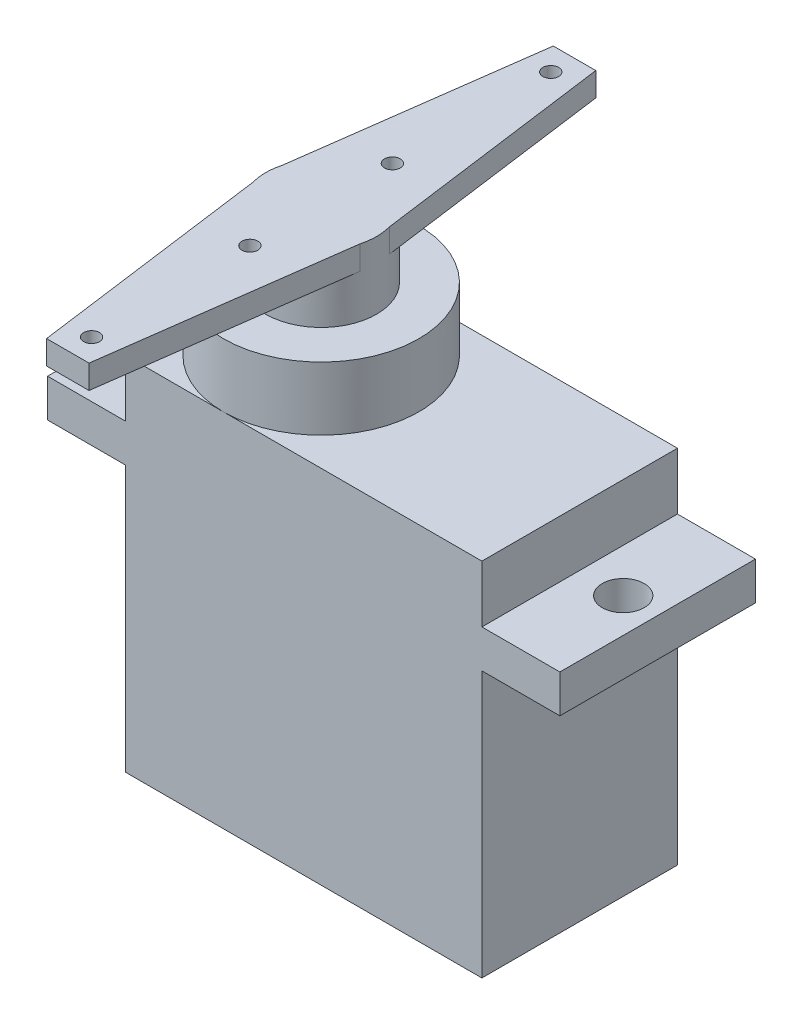
ISO-10303-21;
HEADER;
FILE_DESCRIPTION(('STEP AP214'),'2;1');
FILE_NAME('part.step','',(''),(''),'','','');
FILE_SCHEMA(('AUTOMOTIVE_DESIGN { 1 0 10303 214 1 1 1 1 }'));
ENDSEC;
DATA;
#1=APPLICATION_CONTEXT('core data for automotive mechanical design processes');
#2=APPLICATION_PROTOCOL_DEFINITION('international standard','automotive_design',2000,#1);
#3=PRODUCT_CONTEXT('',#1,'mechanical');
#4=PRODUCT('Part','Part','',(#3));
#5=PRODUCT_RELATED_PRODUCT_CATEGORY('part','',(#4));
#6=PRODUCT_DEFINITION_FORMATION('','',#4);
#7=PRODUCT_DEFINITION_CONTEXT('part definition',#1,'design');
#8=PRODUCT_DEFINITION('design','',#6,#7);
#9=PRODUCT_DEFINITION_SHAPE('','',#8);
#10=(LENGTH_UNIT() NAMED_UNIT(*) SI_UNIT(.MILLI.,.METRE.));
#11=(NAMED_UNIT(*) PLANE_ANGLE_UNIT() SI_UNIT($,.RADIAN.));
#12=(NAMED_UNIT(*) SI_UNIT($,.STERADIAN.) SOLID_ANGLE_UNIT());
#13=UNCERTAINTY_MEASURE_WITH_UNIT(LENGTH_MEASURE(1.E-05),#10,'distance_accuracy_value','');
#14=(GEOMETRIC_REPRESENTATION_CONTEXT(3) GLOBAL_UNCERTAINTY_ASSIGNED_CONTEXT((#13)) GLOBAL_UNIT_ASSIGNED_CONTEXT((#10,
#11,#12)) REPRESENTATION_CONTEXT('',''));
#15=CARTESIAN_POINT('',(0.,0.,0.));
#16=DIRECTION('',(0.,0.,1.));
#17=DIRECTION('',(1.,0.,0.));
#18=AXIS2_PLACEMENT_3D('',#15,#16,#17);
#19=CARTESIAN_POINT('',(-5.07499999999999,31.05,0.));
#20=DIRECTION('',(0.,-1.,0.));
#21=DIRECTION('',(0.,0.,-1.));
#22=AXIS2_PLACEMENT_3D('',#19,#20,#21);
#23=CYLINDRICAL_SURFACE('',#22,3.5);
#24=DIRECTION('',(0.,-1.,0.));
#25=VECTOR('',#24,1.);
#26=CARTESIAN_POINT('',(-8.4498833775891,31.05,0.92744929115976));
#27=LINE('',#26,#25);
#28=CARTESIAN_POINT('',(-8.4498833775891,29.55,0.927449291159753));
#29=VERTEX_POINT('',#28);
#30=CARTESIAN_POINT('',(-8.4498833775891,31.05,0.927449291159757));
#31=VERTEX_POINT('',#30);
#32=EDGE_CURVE('E122',#29,#31,#27,.F.);
#33=ORIENTED_EDGE('',*,*,#32,.T.);
#34=CARTESIAN_POINT('',(-5.07499999999999,31.05,0.));
#35=DIRECTION('',(0.,1.,0.));
#36=DIRECTION('',(0.,0.,1.));
#37=AXIS2_PLACEMENT_3D('',#34,#35,#36);
#38=CIRCLE('',#37,3.5);
#39=CARTESIAN_POINT('',(-8.44988337758911,31.05,-0.927449291159721));
#40=VERTEX_POINT('',#39);
#41=EDGE_CURVE('E178',#40,#31,#38,.T.);
#42=ORIENTED_EDGE('',*,*,#41,.F.);
#43=DIRECTION('',(0.,-1.,0.));
#44=VECTOR('',#43,1.);
#45=CARTESIAN_POINT('',(-8.44988337758911,31.05,-0.927449291159721));
#46=LINE('',#45,#44);
#47=CARTESIAN_POINT('',(-8.44988337758911,29.55,-0.92744929115973));
#48=VERTEX_POINT('',#47);
#49=EDGE_CURVE('E172',#40,#48,#46,.T.);
#50=ORIENTED_EDGE('',*,*,#49,.T.);
#51=CARTESIAN_POINT('',(-5.07499999999999,29.55,0.));
#52=DIRECTION('',(0.,1.,0.));
#53=DIRECTION('',(0.,0.,1.));
#54=AXIS2_PLACEMENT_3D('',#51,#52,#53);
#55=CIRCLE('',#54,3.5);
#56=CARTESIAN_POINT('',(-1.7001166224109,29.55,-0.927449291159806));
#57=VERTEX_POINT('',#56);
#58=EDGE_CURVE('E12',#57,#48,#55,.T.);
#59=ORIENTED_EDGE('',*,*,#58,.F.);
#60=DIRECTION('',(0.,-1.,0.));
#61=VECTOR('',#60,1.);
#62=CARTESIAN_POINT('',(-1.7001166224109,31.05,-0.927449291159806));
#63=LINE('',#62,#61);
#64=CARTESIAN_POINT('',(-1.7001166224109,31.05,-0.927449291159806));
#65=VERTEX_POINT('',#64);
#66=EDGE_CURVE('E169',#57,#65,#63,.F.);
#67=ORIENTED_EDGE('',*,*,#66,.T.);
#68=CARTESIAN_POINT('',(-1.70011662241089,31.05,0.927449291159777));
#69=VERTEX_POINT('',#68);
#70=EDGE_CURVE('E177',#69,#65,#38,.T.);
#71=ORIENTED_EDGE('',*,*,#70,.F.);
#72=DIRECTION('',(0.,-1.,0.));
#73=VECTOR('',#72,1.);
#74=CARTESIAN_POINT('',(-1.70011662241089,31.05,0.927449291159787));
#75=LINE('',#74,#73);
#76=CARTESIAN_POINT('',(-1.70011662241089,29.55,0.927449291159777));
#77=VERTEX_POINT('',#76);
#78=EDGE_CURVE('E162',#69,#77,#75,.T.);
#79=ORIENTED_EDGE('',*,*,#78,.T.);
#80=EDGE_CURVE('E54',#29,#77,#55,.T.);
#81=ORIENTED_EDGE('',*,*,#80,.F.);
#82=EDGE_LOOP('',(#33,#42,#50,#59,#67,#71,#79,#81));
#83=FACE_BOUND('',#82,.T.);
#84=CARTESIAN_POINT('',(-5.07499999999999,26.8,0.));
#85=DIRECTION('',(0.,1.,0.));
#86=DIRECTION('',(0.,0.,1.));
#87=AXIS2_PLACEMENT_3D('',#84,#85,#86);
#88=CIRCLE('',#87,3.5);
#89=CARTESIAN_POINT('',(-5.07499999999999,26.8,3.5));
#90=VERTEX_POINT('',#89);
#91=EDGE_CURVE('E176',#90,#90,#88,.T.);
#92=ORIENTED_EDGE('',*,*,#91,.T.);
#93=EDGE_LOOP('',(#92));
#94=FACE_BOUND('',#93,.T.);
#95=ADVANCED_FACE('F51',(#83,#94),#23,.T.);
#96=CARTESIAN_POINT('',(-5.07499999999999,31.05,0.));
#97=DIRECTION('',(0.,1.,0.));
#98=DIRECTION('',(0.,0.,1.));
#99=AXIS2_PLACEMENT_3D('',#96,#97,#98);
#100=PLANE('',#99);
#101=ORIENTED_EDGE('',*,*,#70,.T.);
#102=DIRECTION('',(-0.133692943723886,0.,-0.99102280336955));
#103=VECTOR('',#102,1.);
#104=CARTESIAN_POINT('',(-1.57499999999999,31.05,0.));
#105=LINE('',#104,#103);
#106=CARTESIAN_POINT('',(-3.73346405583113,31.05,-16.));
#107=VERTEX_POINT('',#106);
#108=EDGE_CURVE('E155',#65,#107,#105,.T.);
#109=ORIENTED_EDGE('',*,*,#108,.T.);
#110=DIRECTION('',(-1.,0.,0.));
#111=VECTOR('',#110,1.);
#112=CARTESIAN_POINT('',(-6.4165359441691,31.05,-16.));
#113=LINE('',#112,#111);
#114=CARTESIAN_POINT('',(-6.4165359441691,31.05,-16.));
#115=VERTEX_POINT('',#114);
#116=EDGE_CURVE('E157',#107,#115,#113,.T.);
#117=ORIENTED_EDGE('',*,*,#116,.T.);
#118=DIRECTION('',(-0.133692943723871,0.,0.991022803369552));
#119=VECTOR('',#118,1.);
#120=CARTESIAN_POINT('',(-8.57499999999999,31.05,0.));
#121=LINE('',#120,#119);
#122=EDGE_CURVE('E65',#115,#40,#121,.T.);
#123=ORIENTED_EDGE('',*,*,#122,.T.);
#124=ORIENTED_EDGE('',*,*,#41,.T.);
#125=DIRECTION('',(0.133692943723879,0.,0.991022803369551));
#126=VECTOR('',#125,1.);
#127=CARTESIAN_POINT('',(-8.57499999999999,31.05,0.));
#128=LINE('',#127,#126);
#129=CARTESIAN_POINT('',(-6.41653594416898,31.05,16.));
#130=VERTEX_POINT('',#129);
#131=EDGE_CURVE('E150',#31,#130,#128,.T.);
#132=ORIENTED_EDGE('',*,*,#131,.T.);
#133=DIRECTION('',(1.,0.,0.));
#134=VECTOR('',#133,1.);
#135=CARTESIAN_POINT('',(-6.41653594416898,31.05,16.));
#136=LINE('',#135,#134);
#137=CARTESIAN_POINT('',(-3.73346405583101,31.05,16.));
#138=VERTEX_POINT('',#137);
#139=EDGE_CURVE('E131',#130,#138,#136,.T.);
#140=ORIENTED_EDGE('',*,*,#139,.T.);
#141=DIRECTION('',(0.133692943723879,0.,-0.991022803369551));
#142=VECTOR('',#141,1.);
#143=CARTESIAN_POINT('',(-1.57499999999999,31.05,0.));
#144=LINE('',#143,#142);
#145=EDGE_CURVE('E72',#138,#69,#144,.T.);
#146=ORIENTED_EDGE('',*,*,#145,.T.);
#147=EDGE_LOOP('',(#101,#109,#117,#123,#124,#132,#140,#146));
#148=FACE_BOUND('',#147,.T.);
#149=CARTESIAN_POINT('',(-5.07499999999993,31.05,14.5));
#150=DIRECTION('',(0.,1.,0.));
#151=DIRECTION('',(0.,0.,-1.));
#152=AXIS2_PLACEMENT_3D('',#149,#150,#151);
#153=CIRCLE('',#152,0.5);
#154=CARTESIAN_POINT('',(-5.07499999999993,31.05,14.));
#155=VERTEX_POINT('',#154);
#156=EDGE_CURVE('E265',#155,#155,#153,.T.);
#157=ORIENTED_EDGE('',*,*,#156,.F.);
#158=EDGE_LOOP('',(#157));
#159=FACE_BOUND('',#158,.T.);
#160=CARTESIAN_POINT('',(-5.07499999999998,31.05,4.5));
#161=DIRECTION('',(0.,1.,0.));
#162=DIRECTION('',(0.,0.,-1.));
#163=AXIS2_PLACEMENT_3D('',#160,#161,#162);
#164=CIRCLE('',#163,0.5);
#165=CARTESIAN_POINT('',(-5.07499999999998,31.05,4.));
#166=VERTEX_POINT('',#165);
#167=EDGE_CURVE('E267',#166,#166,#164,.T.);
#168=ORIENTED_EDGE('',*,*,#167,.F.);
#169=EDGE_LOOP('',(#168));
#170=FACE_BOUND('',#169,.T.);
#171=CARTESIAN_POINT('',(-5.07500000000001,31.05,-4.5));
#172=DIRECTION('',(0.,1.,0.));
#173=DIRECTION('',(0.,0.,1.));
#174=AXIS2_PLACEMENT_3D('',#171,#172,#173);
#175=CIRCLE('',#174,0.500000000000001);
#176=CARTESIAN_POINT('',(-5.07500000000001,31.05,-4.));
#177=VERTEX_POINT('',#176);
#178=EDGE_CURVE('E279',#177,#177,#175,.T.);
#179=ORIENTED_EDGE('',*,*,#178,.F.);
#180=EDGE_LOOP('',(#179));
#181=FACE_BOUND('',#180,.T.);
#182=CARTESIAN_POINT('',(-5.07500000000005,31.05,-14.5));
#183=DIRECTION('',(0.,1.,0.));
#184=DIRECTION('',(0.,0.,1.));
#185=AXIS2_PLACEMENT_3D('',#182,#183,#184);
#186=CIRCLE('',#185,0.5);
#187=CARTESIAN_POINT('',(-5.07500000000005,31.05,-14.));
#188=VERTEX_POINT('',#187);
#189=EDGE_CURVE('E273',#188,#188,#186,.T.);
#190=ORIENTED_EDGE('',*,*,#189,.F.);
#191=EDGE_LOOP('',(#190));
#192=FACE_BOUND('',#191,.T.);
#193=ADVANCED_FACE('F183',(#148,#159,#170,#181,#192),#100,.T.);
#194=CARTESIAN_POINT('',(-5.07499999999999,26.8,0.));
#195=DIRECTION('',(0.,1.,0.));
#196=DIRECTION('',(0.,0.,1.));
#197=AXIS2_PLACEMENT_3D('',#194,#195,#196);
#198=PLANE('',#197);
#199=ORIENTED_EDGE('',*,*,#91,.F.);
#200=EDGE_LOOP('',(#199));
#201=FACE_BOUND('',#200,.T.);
#202=ADVANCED_FACE('F222',(#201),#198,.F.);
#203=CARTESIAN_POINT('',(-5.07499999999998,29.55,4.5));
#204=DIRECTION('',(0.,1.,0.));
#205=DIRECTION('',(0.,0.,1.));
#206=AXIS2_PLACEMENT_3D('',#203,#204,#205);
#207=CYLINDRICAL_SURFACE('',#206,0.5);
#208=CARTESIAN_POINT('',(-5.07499999999998,29.55,4.5));
#209=DIRECTION('',(0.,1.,0.));
#210=DIRECTION('',(0.,0.,-1.));
#211=AXIS2_PLACEMENT_3D('',#208,#209,#210);
#212=CIRCLE('',#211,0.5);
#213=CARTESIAN_POINT('',(-5.07499999999998,29.55,4.));
#214=VERTEX_POINT('',#213);
#215=EDGE_CURVE('E270',#214,#214,#212,.T.);
#216=ORIENTED_EDGE('',*,*,#215,.F.);
#217=EDGE_LOOP('',(#216));
#218=FACE_BOUND('',#217,.T.);
#219=ORIENTED_EDGE('',*,*,#167,.T.);
#220=EDGE_LOOP('',(#219));
#221=FACE_BOUND('',#220,.T.);
#222=ADVANCED_FACE('F227',(#218,#221),#207,.F.);
#223=CARTESIAN_POINT('',(-5.07499999999993,29.55,14.5));
#224=DIRECTION('',(0.,1.,0.));
#225=DIRECTION('',(0.,0.,1.));
#226=AXIS2_PLACEMENT_3D('',#223,#224,#225);
#227=CYLINDRICAL_SURFACE('',#226,0.5);
#228=CARTESIAN_POINT('',(-5.07499999999993,29.55,14.5));
#229=DIRECTION('',(0.,1.,0.));
#230=DIRECTION('',(0.,0.,-1.));
#231=AXIS2_PLACEMENT_3D('',#228,#229,#230);
#232=CIRCLE('',#231,0.5);
#233=CARTESIAN_POINT('',(-5.07499999999993,29.55,14.));
#234=VERTEX_POINT('',#233);
#235=EDGE_CURVE('E262',#234,#234,#232,.T.);
#236=ORIENTED_EDGE('',*,*,#235,.F.);
#237=EDGE_LOOP('',(#236));
#238=FACE_BOUND('',#237,.T.);
#239=ORIENTED_EDGE('',*,*,#156,.T.);
#240=EDGE_LOOP('',(#239));
#241=FACE_BOUND('',#240,.T.);
#242=ADVANCED_FACE('F232',(#238,#241),#227,.F.);
#243=CARTESIAN_POINT('',(-6.41653594416898,29.55,16.));
#244=DIRECTION('',(0.,0.,1.));
#245=DIRECTION('',(1.,0.,0.));
#246=AXIS2_PLACEMENT_3D('',#243,#244,#245);
#247=PLANE('',#246);
#248=ORIENTED_EDGE('',*,*,#139,.F.);
#249=DIRECTION('',(0.,1.,0.));
#250=VECTOR('',#249,1.);
#251=CARTESIAN_POINT('',(-6.41653594416898,29.55,16.));
#252=LINE('',#251,#250);
#253=CARTESIAN_POINT('',(-6.41653594416898,29.55,16.));
#254=VERTEX_POINT('',#253);
#255=EDGE_CURVE('E119',#254,#130,#252,.T.);
#256=ORIENTED_EDGE('',*,*,#255,.F.);
#257=DIRECTION('',(1.,0.,0.));
#258=VECTOR('',#257,1.);
#259=CARTESIAN_POINT('',(-6.41653594416898,29.55,16.));
#260=LINE('',#259,#258);
#261=CARTESIAN_POINT('',(-3.73346405583101,29.55,16.));
#262=VERTEX_POINT('',#261);
#263=EDGE_CURVE('E126',#254,#262,#260,.T.);
#264=ORIENTED_EDGE('',*,*,#263,.T.);
#265=DIRECTION('',(0.,1.,0.));
#266=VECTOR('',#265,1.);
#267=CARTESIAN_POINT('',(-3.73346405583101,29.55,16.));
#268=LINE('',#267,#266);
#269=EDGE_CURVE('E132',#262,#138,#268,.T.);
#270=ORIENTED_EDGE('',*,*,#269,.T.);
#271=EDGE_LOOP('',(#248,#256,#264,#270));
#272=FACE_BOUND('',#271,.T.);
#273=ADVANCED_FACE('F130',(#272),#247,.T.);
#274=CARTESIAN_POINT('',(0.,29.55,0.));
#275=DIRECTION('',(0.,1.,0.));
#276=DIRECTION('',(0.,0.,1.));
#277=AXIS2_PLACEMENT_3D('',#274,#275,#276);
#278=PLANE('',#277);
#279=ORIENTED_EDGE('',*,*,#235,.T.);
#280=EDGE_LOOP('',(#279));
#281=FACE_BOUND('',#280,.T.);
#282=ORIENTED_EDGE('',*,*,#215,.T.);
#283=EDGE_LOOP('',(#282));
#284=FACE_BOUND('',#283,.T.);
#285=DIRECTION('',(0.133692943723879,0.,0.991022803369551));
#286=VECTOR('',#285,1.);
#287=CARTESIAN_POINT('',(-8.57499999999999,29.55,0.));
#288=LINE('',#287,#286);
#289=EDGE_CURVE('E115',#29,#254,#288,.T.);
#290=ORIENTED_EDGE('',*,*,#289,.F.);
#291=ORIENTED_EDGE('',*,*,#80,.T.);
#292=DIRECTION('',(0.133692943723879,0.,-0.991022803369551));
#293=VECTOR('',#292,1.);
#294=CARTESIAN_POINT('',(-1.57499999999999,29.55,0.));
#295=LINE('',#294,#293);
#296=EDGE_CURVE('E138',#262,#77,#295,.T.);
#297=ORIENTED_EDGE('',*,*,#296,.F.);
#298=ORIENTED_EDGE('',*,*,#263,.F.);
#299=EDGE_LOOP('',(#290,#291,#297,#298));
#300=FACE_BOUND('',#299,.T.);
#301=ADVANCED_FACE('F136',(#281,#284,#300),#278,.F.);
#302=CARTESIAN_POINT('',(-1.57499999999999,29.55,0.));
#303=DIRECTION('',(0.991022803369551,0.,0.133692943723879));
#304=DIRECTION('',(0.133692943723879,0.,-0.991022803369551));
#305=AXIS2_PLACEMENT_3D('',#302,#303,#304);
#306=PLANE('',#305);
#307=ORIENTED_EDGE('',*,*,#78,.F.);
#308=ORIENTED_EDGE('',*,*,#145,.F.);
#309=ORIENTED_EDGE('',*,*,#269,.F.);
#310=ORIENTED_EDGE('',*,*,#296,.T.);
#311=EDGE_LOOP('',(#307,#308,#309,#310));
#312=FACE_BOUND('',#311,.T.);
#313=ADVANCED_FACE('F188',(#312),#306,.T.);
#314=CARTESIAN_POINT('',(-8.57499999999999,29.55,0.));
#315=DIRECTION('',(-0.991022803369551,0.,0.133692943723879));
#316=DIRECTION('',(0.133692943723879,0.,0.991022803369551));
#317=AXIS2_PLACEMENT_3D('',#314,#315,#316);
#318=PLANE('',#317);
#319=ORIENTED_EDGE('',*,*,#32,.F.);
#320=ORIENTED_EDGE('',*,*,#289,.T.);
#321=ORIENTED_EDGE('',*,*,#255,.T.);
#322=ORIENTED_EDGE('',*,*,#131,.F.);
#323=EDGE_LOOP('',(#319,#320,#321,#322));
#324=FACE_BOUND('',#323,.T.);
#325=ADVANCED_FACE('F117',(#324),#318,.T.);
#326=CARTESIAN_POINT('',(-5.07500000000001,29.55,-4.5));
#327=DIRECTION('',(0.,1.,0.));
#328=DIRECTION('',(0.,0.,1.));
#329=AXIS2_PLACEMENT_3D('',#326,#327,#328);
#330=CIRCLE('',#329,0.500000000000001);
#331=CARTESIAN_POINT('',(-5.07500000000001,29.55,-4.));
#332=VERTEX_POINT('',#331);
#333=EDGE_CURVE('E152',#332,#332,#330,.T.);
#334=ORIENTED_EDGE('',*,*,#333,.T.);
#335=EDGE_LOOP('',(#334));
#336=FACE_BOUND('',#335,.T.);
#337=CARTESIAN_POINT('',(-5.07500000000005,29.55,-14.5));
#338=DIRECTION('',(0.,1.,0.));
#339=DIRECTION('',(0.,0.,1.));
#340=AXIS2_PLACEMENT_3D('',#337,#338,#339);
#341=CIRCLE('',#340,0.5);
#342=CARTESIAN_POINT('',(-5.07500000000005,29.55,-14.));
#343=VERTEX_POINT('',#342);
#344=EDGE_CURVE('E276',#343,#343,#341,.T.);
#345=ORIENTED_EDGE('',*,*,#344,.T.);
#346=EDGE_LOOP('',(#345));
#347=FACE_BOUND('',#346,.T.);
#348=DIRECTION('',(-0.133692943723886,0.,-0.99102280336955));
#349=VECTOR('',#348,1.);
#350=CARTESIAN_POINT('',(-1.57499999999999,29.55,0.));
#351=LINE('',#350,#349);
#352=CARTESIAN_POINT('',(-3.73346405583113,29.55,-16.));
#353=VERTEX_POINT('',#352);
#354=EDGE_CURVE('E140',#57,#353,#351,.T.);
#355=ORIENTED_EDGE('',*,*,#354,.F.);
#356=ORIENTED_EDGE('',*,*,#58,.T.);
#357=DIRECTION('',(-0.133692943723871,0.,0.991022803369552));
#358=VECTOR('',#357,1.);
#359=CARTESIAN_POINT('',(-8.57499999999999,29.55,0.));
#360=LINE('',#359,#358);
#361=CARTESIAN_POINT('',(-6.4165359441691,29.55,-16.));
#362=VERTEX_POINT('',#361);
#363=EDGE_CURVE('E133',#362,#48,#360,.T.);
#364=ORIENTED_EDGE('',*,*,#363,.F.);
#365=DIRECTION('',(-1.,0.,0.));
#366=VECTOR('',#365,1.);
#367=CARTESIAN_POINT('',(-6.4165359441691,29.55,-16.));
#368=LINE('',#367,#366);
#369=EDGE_CURVE('E145',#353,#362,#368,.T.);
#370=ORIENTED_EDGE('',*,*,#369,.F.);
#371=EDGE_LOOP('',(#355,#356,#364,#370));
#372=FACE_BOUND('',#371,.T.);
#373=ADVANCED_FACE('F203',(#336,#347,#372),#278,.F.);
#374=CARTESIAN_POINT('',(-8.57499999999999,29.55,0.));
#375=DIRECTION('',(-0.991022803369552,0.,-0.133692943723871));
#376=DIRECTION('',(-0.133692943723871,0.,0.991022803369552));
#377=AXIS2_PLACEMENT_3D('',#374,#375,#376);
#378=PLANE('',#377);
#379=ORIENTED_EDGE('',*,*,#49,.F.);
#380=ORIENTED_EDGE('',*,*,#122,.F.);
#381=DIRECTION('',(0.,1.,0.));
#382=VECTOR('',#381,1.);
#383=CARTESIAN_POINT('',(-6.4165359441691,29.55,-16.));
#384=LINE('',#383,#382);
#385=EDGE_CURVE('E160',#362,#115,#384,.T.);
#386=ORIENTED_EDGE('',*,*,#385,.F.);
#387=ORIENTED_EDGE('',*,*,#363,.T.);
#388=EDGE_LOOP('',(#379,#380,#386,#387));
#389=FACE_BOUND('',#388,.T.);
#390=ADVANCED_FACE('F200',(#389),#378,.T.);
#391=CARTESIAN_POINT('',(-1.57499999999999,29.55,0.));
#392=DIRECTION('',(0.99102280336955,0.,-0.133692943723886));
#393=DIRECTION('',(-0.133692943723886,0.,-0.99102280336955));
#394=AXIS2_PLACEMENT_3D('',#391,#392,#393);
#395=PLANE('',#394);
#396=ORIENTED_EDGE('',*,*,#66,.F.);
#397=ORIENTED_EDGE('',*,*,#354,.T.);
#398=DIRECTION('',(0.,1.,0.));
#399=VECTOR('',#398,1.);
#400=CARTESIAN_POINT('',(-3.73346405583113,29.55,-16.));
#401=LINE('',#400,#399);
#402=EDGE_CURVE('E163',#353,#107,#401,.T.);
#403=ORIENTED_EDGE('',*,*,#402,.T.);
#404=ORIENTED_EDGE('',*,*,#108,.F.);
#405=EDGE_LOOP('',(#396,#397,#403,#404));
#406=FACE_BOUND('',#405,.T.);
#407=ADVANCED_FACE('F192',(#406),#395,.T.);
#408=CARTESIAN_POINT('',(-6.4165359441691,29.55,-16.));
#409=DIRECTION('',(0.,0.,-1.));
#410=DIRECTION('',(-1.,0.,0.));
#411=AXIS2_PLACEMENT_3D('',#408,#409,#410);
#412=PLANE('',#411);
#413=ORIENTED_EDGE('',*,*,#116,.F.);
#414=ORIENTED_EDGE('',*,*,#402,.F.);
#415=ORIENTED_EDGE('',*,*,#369,.T.);
#416=ORIENTED_EDGE('',*,*,#385,.T.);
#417=EDGE_LOOP('',(#413,#414,#415,#416));
#418=FACE_BOUND('',#417,.T.);
#419=ADVANCED_FACE('F198',(#418),#412,.T.);
#420=CARTESIAN_POINT('',(-5.07500000000001,29.55,-4.5));
#421=DIRECTION('',(0.,1.,0.));
#422=DIRECTION('',(0.,0.,1.));
#423=AXIS2_PLACEMENT_3D('',#420,#421,#422);
#424=CYLINDRICAL_SURFACE('',#423,0.500000000000001);
#425=ORIENTED_EDGE('',*,*,#333,.F.);
#426=EDGE_LOOP('',(#425));
#427=FACE_BOUND('',#426,.T.);
#428=ORIENTED_EDGE('',*,*,#178,.T.);
#429=EDGE_LOOP('',(#428));
#430=FACE_BOUND('',#429,.T.);
#431=ADVANCED_FACE('F238',(#427,#430),#424,.F.);
#432=CARTESIAN_POINT('',(-5.07500000000005,29.55,-14.5));
#433=DIRECTION('',(0.,1.,0.));
#434=DIRECTION('',(0.,0.,1.));
#435=AXIS2_PLACEMENT_3D('',#432,#433,#434);
#436=CYLINDRICAL_SURFACE('',#435,0.5);
#437=ORIENTED_EDGE('',*,*,#344,.F.);
#438=EDGE_LOOP('',(#437));
#439=FACE_BOUND('',#438,.T.);
#440=ORIENTED_EDGE('',*,*,#189,.T.);
#441=EDGE_LOOP('',(#440));
#442=FACE_BOUND('',#441,.T.);
#443=ADVANCED_FACE('F242',(#439,#442),#436,.F.);
#444=CLOSED_SHELL('',(#95,#193,#202,#222,#242,#273,#301,#313,#325,#373,#390,#407,#419,#431,#443));
#445=MANIFOLD_SOLID_BREP('B2',#444);
#446=CARTESIAN_POINT('',(0.,22.8,0.));
#447=DIRECTION('',(0.,1.,0.));
#448=DIRECTION('',(0.,0.,1.));
#449=AXIS2_PLACEMENT_3D('',#446,#447,#448);
#450=PLANE('',#449);
#451=CARTESIAN_POINT('',(-5.07499999999999,22.8,0.));
#452=DIRECTION('',(0.,1.,0.));
#453=DIRECTION('',(0.,0.,1.));
#454=AXIS2_PLACEMENT_3D('',#451,#452,#453);
#455=CIRCLE('',#454,6.175);
#456=CARTESIAN_POINT('',(-5.07499999999999,22.8,6.175));
#457=VERTEX_POINT('',#456);
#458=CARTESIAN_POINT('',(-5.07499999999999,22.8,-6.175));
#459=VERTEX_POINT('',#458);
#460=EDGE_CURVE('E419',#457,#459,#455,.T.);
#461=ORIENTED_EDGE('',*,*,#460,.F.);
#462=DIRECTION('',(1.,0.,0.));
#463=VECTOR('',#462,1.);
#464=CARTESIAN_POINT('',(-11.25,22.8,6.175));
#465=LINE('',#464,#463);
#466=CARTESIAN_POINT('',(11.25,22.8,6.175));
#467=VERTEX_POINT('',#466);
#468=EDGE_CURVE('E513',#457,#467,#465,.T.);
#469=ORIENTED_EDGE('',*,*,#468,.T.);
#470=DIRECTION('',(0.,0.,-1.));
#471=VECTOR('',#470,1.);
#472=CARTESIAN_POINT('',(11.25,22.8,-6.175));
#473=LINE('',#472,#471);
#474=CARTESIAN_POINT('',(11.25,22.8,-6.175));
#475=VERTEX_POINT('',#474);
#476=EDGE_CURVE('E596',#467,#475,#473,.T.);
#477=ORIENTED_EDGE('',*,*,#476,.T.);
#478=DIRECTION('',(-1.,0.,0.));
#479=VECTOR('',#478,1.);
#480=CARTESIAN_POINT('',(-11.25,22.8,-6.175));
#481=LINE('',#480,#479);
#482=EDGE_CURVE('E527',#475,#459,#481,.T.);
#483=ORIENTED_EDGE('',*,*,#482,.T.);
#484=EDGE_LOOP('',(#461,#469,#477,#483));
#485=FACE_BOUND('',#484,.T.);
#486=ADVANCED_FACE('F408',(#485),#450,.T.);
#487=CARTESIAN_POINT('',(-11.25,22.8,0.));
#488=VERTEX_POINT('',#487);
#489=EDGE_CURVE('E49',#459,#488,#455,.T.);
#490=ORIENTED_EDGE('',*,*,#489,.F.);
#491=CARTESIAN_POINT('',(-11.25,22.8,-6.175));
#492=VERTEX_POINT('',#491);
#493=EDGE_CURVE('E598',#459,#492,#481,.T.);
#494=ORIENTED_EDGE('',*,*,#493,.T.);
#495=DIRECTION('',(0.,0.,1.));
#496=VECTOR('',#495,1.);
#497=CARTESIAN_POINT('',(-11.25,22.8,-6.175));
#498=LINE('',#497,#496);
#499=EDGE_CURVE('E524',#492,#488,#498,.T.);
#500=ORIENTED_EDGE('',*,*,#499,.T.);
#501=EDGE_LOOP('',(#490,#494,#500));
#502=FACE_BOUND('',#501,.T.);
#503=ADVANCED_FACE('F647',(#502),#450,.T.);
#504=CARTESIAN_POINT('',(11.25,22.8,-6.175));
#505=DIRECTION('',(-1.,0.,0.));
#506=DIRECTION('',(0.,0.,1.));
#507=AXIS2_PLACEMENT_3D('',#504,#505,#506);
#508=PLANE('',#507);
#509=DIRECTION('',(0.,0.,1.));
#510=VECTOR('',#509,1.);
#511=CARTESIAN_POINT('',(11.25,19.2,-6.175));
#512=LINE('',#511,#510);
#513=CARTESIAN_POINT('',(11.25,19.2,-6.175));
#514=VERTEX_POINT('',#513);
#515=CARTESIAN_POINT('',(11.25,19.2,6.175));
#516=VERTEX_POINT('',#515);
#517=EDGE_CURVE('E588',#514,#516,#512,.T.);
#518=ORIENTED_EDGE('',*,*,#517,.F.);
#519=DIRECTION('',(0.,-1.,0.));
#520=VECTOR('',#519,1.);
#521=CARTESIAN_POINT('',(11.25,22.8,-6.175));
#522=LINE('',#521,#520);
#523=EDGE_CURVE('E412',#475,#514,#522,.T.);
#524=ORIENTED_EDGE('',*,*,#523,.F.);
#525=ORIENTED_EDGE('',*,*,#476,.F.);
#526=DIRECTION('',(0.,-1.,0.));
#527=VECTOR('',#526,1.);
#528=CARTESIAN_POINT('',(11.25,22.8,6.175));
#529=LINE('',#528,#527);
#530=EDGE_CURVE('E520',#467,#516,#529,.T.);
#531=ORIENTED_EDGE('',*,*,#530,.T.);
#532=EDGE_LOOP('',(#518,#524,#525,#531));
#533=FACE_BOUND('',#532,.T.);
#534=ADVANCED_FACE('F649',(#533),#508,.F.);
#535=CARTESIAN_POINT('',(-11.25,22.8,-6.175));
#536=DIRECTION('',(1.,0.,0.));
#537=DIRECTION('',(0.,0.,-1.));
#538=AXIS2_PLACEMENT_3D('',#535,#536,#537);
#539=PLANE('',#538);
#540=DIRECTION('',(0.,0.,-1.));
#541=VECTOR('',#540,1.);
#542=CARTESIAN_POINT('',(-11.25,19.2,-6.175));
#543=LINE('',#542,#541);
#544=CARTESIAN_POINT('',(-11.25,19.2,6.175));
#545=VERTEX_POINT('',#544);
#546=CARTESIAN_POINT('',(-11.25,19.2,-6.175));
#547=VERTEX_POINT('',#546);
#548=EDGE_CURVE('E579',#545,#547,#543,.T.);
#549=ORIENTED_EDGE('',*,*,#548,.F.);
#550=DIRECTION('',(0.,-1.,0.));
#551=VECTOR('',#550,1.);
#552=CARTESIAN_POINT('',(-11.25,22.8,6.175));
#553=LINE('',#552,#551);
#554=CARTESIAN_POINT('',(-11.25,22.8,6.175));
#555=VERTEX_POINT('',#554);
#556=EDGE_CURVE('E614',#555,#545,#553,.T.);
#557=ORIENTED_EDGE('',*,*,#556,.F.);
#558=EDGE_CURVE('E508',#488,#555,#498,.T.);
#559=ORIENTED_EDGE('',*,*,#558,.F.);
#560=ORIENTED_EDGE('',*,*,#499,.F.);
#561=DIRECTION('',(0.,-1.,0.));
#562=VECTOR('',#561,1.);
#563=CARTESIAN_POINT('',(-11.25,22.8,-6.175));
#564=LINE('',#563,#562);
#565=EDGE_CURVE('E616',#492,#547,#564,.T.);
#566=ORIENTED_EDGE('',*,*,#565,.T.);
#567=EDGE_LOOP('',(#549,#557,#559,#560,#566));
#568=FACE_BOUND('',#567,.T.);
#569=ADVANCED_FACE('F646',(#568),#539,.F.);
#570=CARTESIAN_POINT('',(11.25,16.8,-6.175));
#571=VERTEX_POINT('',#570);
#572=CARTESIAN_POINT('',(11.25,0.,-6.175));
#573=VERTEX_POINT('',#572);
#574=EDGE_CURVE('E532',#571,#573,#522,.T.);
#575=ORIENTED_EDGE('',*,*,#574,.F.);
#576=DIRECTION('',(0.,0.,1.));
#577=VECTOR('',#576,1.);
#578=CARTESIAN_POINT('',(11.25,16.8,-6.175));
#579=LINE('',#578,#577);
#580=CARTESIAN_POINT('',(11.25,16.8,6.175));
#581=VERTEX_POINT('',#580);
#582=EDGE_CURVE('E593',#571,#581,#579,.T.);
#583=ORIENTED_EDGE('',*,*,#582,.T.);
#584=CARTESIAN_POINT('',(11.25,0.,6.175));
#585=VERTEX_POINT('',#584);
#586=EDGE_CURVE('E512',#581,#585,#529,.T.);
#587=ORIENTED_EDGE('',*,*,#586,.T.);
#588=DIRECTION('',(0.,0.,-1.));
#589=VECTOR('',#588,1.);
#590=CARTESIAN_POINT('',(11.25,0.,-6.175));
#591=LINE('',#590,#589);
#592=EDGE_CURVE('E595',#585,#573,#591,.T.);
#593=ORIENTED_EDGE('',*,*,#592,.T.);
#594=EDGE_LOOP('',(#575,#583,#587,#593));
#595=FACE_BOUND('',#594,.T.);
#596=ADVANCED_FACE('F410',(#595),#508,.F.);
#597=CARTESIAN_POINT('',(-11.25,22.8,-6.175));
#598=DIRECTION('',(0.,0.,1.));
#599=DIRECTION('',(1.,0.,0.));
#600=AXIS2_PLACEMENT_3D('',#597,#598,#599);
#601=PLANE('',#600);
#602=CARTESIAN_POINT('',(-11.25,16.8,-6.175));
#603=VERTEX_POINT('',#602);
#604=CARTESIAN_POINT('',(-11.25,0.,-6.175));
#605=VERTEX_POINT('',#604);
#606=EDGE_CURVE('E615',#603,#605,#564,.T.);
#607=ORIENTED_EDGE('',*,*,#606,.F.);
#608=DIRECTION('',(-1.,0.,0.));
#609=VECTOR('',#608,1.);
#610=CARTESIAN_POINT('',(-16.175,16.8,-6.175));
#611=LINE('',#610,#609);
#612=CARTESIAN_POINT('',(-16.175,16.8,-6.175));
#613=VERTEX_POINT('',#612);
#614=EDGE_CURVE('E551',#603,#613,#611,.T.);
#615=ORIENTED_EDGE('',*,*,#614,.T.);
#616=DIRECTION('',(0.,1.,0.));
#617=VECTOR('',#616,1.);
#618=CARTESIAN_POINT('',(-16.175,16.8,-6.175));
#619=LINE('',#618,#617);
#620=CARTESIAN_POINT('',(-16.175,19.2,-6.175));
#621=VERTEX_POINT('',#620);
#622=EDGE_CURVE('E582',#613,#621,#619,.T.);
#623=ORIENTED_EDGE('',*,*,#622,.T.);
#624=DIRECTION('',(-1.,0.,0.));
#625=VECTOR('',#624,1.);
#626=CARTESIAN_POINT('',(-16.175,19.2,-6.175));
#627=LINE('',#626,#625);
#628=EDGE_CURVE('E566',#547,#621,#627,.T.);
#629=ORIENTED_EDGE('',*,*,#628,.F.);
#630=ORIENTED_EDGE('',*,*,#565,.F.);
#631=ORIENTED_EDGE('',*,*,#493,.F.);
#632=ORIENTED_EDGE('',*,*,#482,.F.);
#633=ORIENTED_EDGE('',*,*,#523,.T.);
#634=CARTESIAN_POINT('',(16.175,19.2,-6.175));
#635=VERTEX_POINT('',#634);
#636=EDGE_CURVE('E567',#635,#514,#627,.T.);
#637=ORIENTED_EDGE('',*,*,#636,.F.);
#638=DIRECTION('',(0.,1.,0.));
#639=VECTOR('',#638,1.);
#640=CARTESIAN_POINT('',(16.175,16.8,-6.175));
#641=LINE('',#640,#639);
#642=CARTESIAN_POINT('',(16.175,16.8,-6.175));
#643=VERTEX_POINT('',#642);
#644=EDGE_CURVE('E563',#643,#635,#641,.T.);
#645=ORIENTED_EDGE('',*,*,#644,.F.);
#646=EDGE_CURVE('E553',#643,#571,#611,.T.);
#647=ORIENTED_EDGE('',*,*,#646,.T.);
#648=ORIENTED_EDGE('',*,*,#574,.T.);
#649=DIRECTION('',(-1.,0.,0.));
#650=VECTOR('',#649,1.);
#651=CARTESIAN_POINT('',(-11.25,0.,-6.175));
#652=LINE('',#651,#650);
#653=EDGE_CURVE('E604',#573,#605,#652,.T.);
#654=ORIENTED_EDGE('',*,*,#653,.T.);
#655=EDGE_LOOP('',(#607,#615,#623,#629,#630,#631,#632,#633,#637,#645,#647,#648,#654));
#656=FACE_BOUND('',#655,.T.);
#657=ADVANCED_FACE('F629',(#656),#601,.F.);
#658=CARTESIAN_POINT('',(-11.25,16.8,6.175));
#659=VERTEX_POINT('',#658);
#660=CARTESIAN_POINT('',(-11.25,0.,6.175));
#661=VERTEX_POINT('',#660);
#662=EDGE_CURVE('E613',#659,#661,#553,.T.);
#663=ORIENTED_EDGE('',*,*,#662,.F.);
#664=DIRECTION('',(0.,0.,-1.));
#665=VECTOR('',#664,1.);
#666=CARTESIAN_POINT('',(-11.25,16.8,-6.175));
#667=LINE('',#666,#665);
#668=EDGE_CURVE('E591',#659,#603,#667,.T.);
#669=ORIENTED_EDGE('',*,*,#668,.T.);
#670=ORIENTED_EDGE('',*,*,#606,.T.);
#671=DIRECTION('',(0.,0.,1.));
#672=VECTOR('',#671,1.);
#673=CARTESIAN_POINT('',(-11.25,0.,-6.175));
#674=LINE('',#673,#672);
#675=EDGE_CURVE('E607',#605,#661,#674,.T.);
#676=ORIENTED_EDGE('',*,*,#675,.T.);
#677=EDGE_LOOP('',(#663,#669,#670,#676));
#678=FACE_BOUND('',#677,.T.);
#679=ADVANCED_FACE('F622',(#678),#539,.F.);
#680=CARTESIAN_POINT('',(-11.25,22.8,6.175));
#681=DIRECTION('',(0.,0.,-1.));
#682=DIRECTION('',(-1.,0.,0.));
#683=AXIS2_PLACEMENT_3D('',#680,#681,#682);
#684=PLANE('',#683);
#685=ORIENTED_EDGE('',*,*,#586,.F.);
#686=DIRECTION('',(1.,0.,0.));
#687=VECTOR('',#686,1.);
#688=CARTESIAN_POINT('',(-16.175,16.8,6.175));
#689=LINE('',#688,#687);
#690=CARTESIAN_POINT('',(16.175,16.8,6.175));
#691=VERTEX_POINT('',#690);
#692=EDGE_CURVE('E559',#581,#691,#689,.T.);
#693=ORIENTED_EDGE('',*,*,#692,.T.);
#694=DIRECTION('',(0.,1.,0.));
#695=VECTOR('',#694,1.);
#696=CARTESIAN_POINT('',(16.175,16.8,6.175));
#697=LINE('',#696,#695);
#698=CARTESIAN_POINT('',(16.175,19.2,6.175));
#699=VERTEX_POINT('',#698);
#700=EDGE_CURVE('E576',#691,#699,#697,.T.);
#701=ORIENTED_EDGE('',*,*,#700,.T.);
#702=DIRECTION('',(1.,0.,0.));
#703=VECTOR('',#702,1.);
#704=CARTESIAN_POINT('',(-16.175,19.2,6.175));
#705=LINE('',#704,#703);
#706=EDGE_CURVE('E573',#516,#699,#705,.T.);
#707=ORIENTED_EDGE('',*,*,#706,.F.);
#708=ORIENTED_EDGE('',*,*,#530,.F.);
#709=ORIENTED_EDGE('',*,*,#468,.F.);
#710=EDGE_CURVE('E505',#555,#457,#465,.T.);
#711=ORIENTED_EDGE('',*,*,#710,.F.);
#712=ORIENTED_EDGE('',*,*,#556,.T.);
#713=CARTESIAN_POINT('',(-16.175,19.2,6.175));
#714=VERTEX_POINT('',#713);
#715=EDGE_CURVE('E552',#714,#545,#705,.T.);
#716=ORIENTED_EDGE('',*,*,#715,.F.);
#717=DIRECTION('',(0.,1.,0.));
#718=VECTOR('',#717,1.);
#719=CARTESIAN_POINT('',(-16.175,16.8,6.175));
#720=LINE('',#719,#718);
#721=CARTESIAN_POINT('',(-16.175,16.8,6.175));
#722=VERTEX_POINT('',#721);
#723=EDGE_CURVE('E580',#722,#714,#720,.T.);
#724=ORIENTED_EDGE('',*,*,#723,.F.);
#725=EDGE_CURVE('E560',#722,#659,#689,.T.);
#726=ORIENTED_EDGE('',*,*,#725,.T.);
#727=ORIENTED_EDGE('',*,*,#662,.T.);
#728=DIRECTION('',(1.,0.,0.));
#729=VECTOR('',#728,1.);
#730=CARTESIAN_POINT('',(-11.25,0.,6.175));
#731=LINE('',#730,#729);
#732=EDGE_CURVE('E599',#661,#585,#731,.T.);
#733=ORIENTED_EDGE('',*,*,#732,.T.);
#734=EDGE_LOOP('',(#685,#693,#701,#707,#708,#709,#711,#712,#716,#724,#726,#727,#733));
#735=FACE_BOUND('',#734,.T.);
#736=ADVANCED_FACE('F518',(#735),#684,.F.);
#737=EDGE_CURVE('E417',#488,#457,#455,.T.);
#738=ORIENTED_EDGE('',*,*,#737,.F.);
#739=ORIENTED_EDGE('',*,*,#558,.T.);
#740=ORIENTED_EDGE('',*,*,#710,.T.);
#741=EDGE_LOOP('',(#738,#739,#740));
#742=FACE_BOUND('',#741,.T.);
#743=ADVANCED_FACE('F507',(#742),#450,.T.);
#744=CARTESIAN_POINT('',(0.,0.,0.));
#745=DIRECTION('',(0.,1.,0.));
#746=DIRECTION('',(0.,0.,1.));
#747=AXIS2_PLACEMENT_3D('',#744,#745,#746);
#748=PLANE('',#747);
#749=ORIENTED_EDGE('',*,*,#592,.F.);
#750=ORIENTED_EDGE('',*,*,#732,.F.);
#751=ORIENTED_EDGE('',*,*,#675,.F.);
#752=ORIENTED_EDGE('',*,*,#653,.F.);
#753=EDGE_LOOP('',(#749,#750,#751,#752));
#754=FACE_BOUND('',#753,.T.);
#755=ADVANCED_FACE('F632',(#754),#748,.F.);
#756=CARTESIAN_POINT('',(-16.175,16.8,6.175));
#757=DIRECTION('',(-1.,0.,0.));
#758=DIRECTION('',(0.,0.,1.));
#759=AXIS2_PLACEMENT_3D('',#756,#757,#758);
#760=PLANE('',#759);
#761=DIRECTION('',(0.,0.,1.));
#762=VECTOR('',#761,1.);
#763=CARTESIAN_POINT('',(-16.175,19.2,6.175));
#764=LINE('',#763,#762);
#765=EDGE_CURVE('E570',#621,#714,#764,.T.);
#766=ORIENTED_EDGE('',*,*,#765,.F.);
#767=ORIENTED_EDGE('',*,*,#622,.F.);
#768=DIRECTION('',(0.,0.,1.));
#769=VECTOR('',#768,1.);
#770=CARTESIAN_POINT('',(-16.175,16.8,6.175));
#771=LINE('',#770,#769);
#772=EDGE_CURVE('E556',#613,#722,#771,.T.);
#773=ORIENTED_EDGE('',*,*,#772,.T.);
#774=ORIENTED_EDGE('',*,*,#723,.T.);
#775=EDGE_LOOP('',(#766,#767,#773,#774));
#776=FACE_BOUND('',#775,.T.);
#777=ADVANCED_FACE('F642',(#776),#760,.T.);
#778=CARTESIAN_POINT('',(-14.,16.8,0.));
#779=DIRECTION('',(0.,1.,0.));
#780=DIRECTION('',(0.,0.,1.));
#781=AXIS2_PLACEMENT_3D('',#778,#779,#780);
#782=CYLINDRICAL_SURFACE('',#781,1.325);
#783=CARTESIAN_POINT('',(-14.,16.8,0.));
#784=DIRECTION('',(0.,1.,0.));
#785=DIRECTION('',(0.,0.,1.));
#786=AXIS2_PLACEMENT_3D('',#783,#784,#785);
#787=CIRCLE('',#786,1.325);
#788=CARTESIAN_POINT('',(-14.,16.8,1.325));
#789=VERTEX_POINT('',#788);
#790=EDGE_CURVE('E542',#789,#789,#787,.T.);
#791=ORIENTED_EDGE('',*,*,#790,.F.);
#792=EDGE_LOOP('',(#791));
#793=FACE_BOUND('',#792,.T.);
#794=CARTESIAN_POINT('',(-14.,19.2,0.));
#795=DIRECTION('',(0.,1.,0.));
#796=DIRECTION('',(0.,0.,1.));
#797=AXIS2_PLACEMENT_3D('',#794,#795,#796);
#798=CIRCLE('',#797,1.325);
#799=CARTESIAN_POINT('',(-14.,19.2,1.325));
#800=VERTEX_POINT('',#799);
#801=EDGE_CURVE('E538',#800,#800,#798,.T.);
#802=ORIENTED_EDGE('',*,*,#801,.T.);
#803=EDGE_LOOP('',(#802));
#804=FACE_BOUND('',#803,.T.);
#805=ADVANCED_FACE('F702',(#793,#804),#782,.F.);
#806=CARTESIAN_POINT('',(0.,19.2,0.));
#807=DIRECTION('',(0.,-1.,0.));
#808=DIRECTION('',(0.,0.,-1.));
#809=AXIS2_PLACEMENT_3D('',#806,#807,#808);
#810=PLANE('',#809);
#811=ORIENTED_EDGE('',*,*,#801,.F.);
#812=EDGE_LOOP('',(#811));
#813=FACE_BOUND('',#812,.T.);
#814=ORIENTED_EDGE('',*,*,#715,.T.);
#815=ORIENTED_EDGE('',*,*,#548,.T.);
#816=ORIENTED_EDGE('',*,*,#628,.T.);
#817=ORIENTED_EDGE('',*,*,#765,.T.);
#818=EDGE_LOOP('',(#814,#815,#816,#817));
#819=FACE_BOUND('',#818,.T.);
#820=ADVANCED_FACE('F645',(#813,#819),#810,.F.);
#821=CARTESIAN_POINT('',(0.,16.8,0.));
#822=DIRECTION('',(0.,-1.,0.));
#823=DIRECTION('',(0.,0.,-1.));
#824=AXIS2_PLACEMENT_3D('',#821,#822,#823);
#825=PLANE('',#824);
#826=ORIENTED_EDGE('',*,*,#790,.T.);
#827=EDGE_LOOP('',(#826));
#828=FACE_BOUND('',#827,.T.);
#829=ORIENTED_EDGE('',*,*,#668,.F.);
#830=ORIENTED_EDGE('',*,*,#725,.F.);
#831=ORIENTED_EDGE('',*,*,#772,.F.);
#832=ORIENTED_EDGE('',*,*,#614,.F.);
#833=EDGE_LOOP('',(#829,#830,#831,#832));
#834=FACE_BOUND('',#833,.T.);
#835=ADVANCED_FACE('F636',(#828,#834),#825,.T.);
#836=CARTESIAN_POINT('',(14.,16.8,0.));
#837=DIRECTION('',(0.,1.,0.));
#838=DIRECTION('',(0.,0.,-1.));
#839=AXIS2_PLACEMENT_3D('',#836,#837,#838);
#840=CIRCLE('',#839,1.325);
#841=CARTESIAN_POINT('',(14.,16.8,-1.325));
#842=VERTEX_POINT('',#841);
#843=EDGE_CURVE('E535',#842,#842,#840,.T.);
#844=ORIENTED_EDGE('',*,*,#843,.T.);
#845=EDGE_LOOP('',(#844));
#846=FACE_BOUND('',#845,.T.);
#847=ORIENTED_EDGE('',*,*,#582,.F.);
#848=ORIENTED_EDGE('',*,*,#646,.F.);
#849=DIRECTION('',(0.,0.,-1.));
#850=VECTOR('',#849,1.);
#851=CARTESIAN_POINT('',(16.175,16.8,6.175));
#852=LINE('',#851,#850);
#853=EDGE_CURVE('E548',#691,#643,#852,.T.);
#854=ORIENTED_EDGE('',*,*,#853,.F.);
#855=ORIENTED_EDGE('',*,*,#692,.F.);
#856=EDGE_LOOP('',(#847,#848,#854,#855));
#857=FACE_BOUND('',#856,.T.);
#858=ADVANCED_FACE('F679',(#846,#857),#825,.T.);
#859=CARTESIAN_POINT('',(14.,19.2,0.));
#860=DIRECTION('',(0.,1.,0.));
#861=DIRECTION('',(0.,0.,-1.));
#862=AXIS2_PLACEMENT_3D('',#859,#860,#861);
#863=CIRCLE('',#862,1.325);
#864=CARTESIAN_POINT('',(14.,19.2,-1.325));
#865=VERTEX_POINT('',#864);
#866=EDGE_CURVE('E539',#865,#865,#863,.T.);
#867=ORIENTED_EDGE('',*,*,#866,.F.);
#868=EDGE_LOOP('',(#867));
#869=FACE_BOUND('',#868,.T.);
#870=ORIENTED_EDGE('',*,*,#636,.T.);
#871=ORIENTED_EDGE('',*,*,#517,.T.);
#872=ORIENTED_EDGE('',*,*,#706,.T.);
#873=DIRECTION('',(0.,0.,-1.));
#874=VECTOR('',#873,1.);
#875=CARTESIAN_POINT('',(16.175,19.2,6.175));
#876=LINE('',#875,#874);
#877=EDGE_CURVE('E545',#699,#635,#876,.T.);
#878=ORIENTED_EDGE('',*,*,#877,.T.);
#879=EDGE_LOOP('',(#870,#871,#872,#878));
#880=FACE_BOUND('',#879,.T.);
#881=ADVANCED_FACE('F687',(#869,#880),#810,.F.);
#882=CARTESIAN_POINT('',(16.175,16.8,6.175));
#883=DIRECTION('',(1.,0.,0.));
#884=DIRECTION('',(0.,0.,-1.));
#885=AXIS2_PLACEMENT_3D('',#882,#883,#884);
#886=PLANE('',#885);
#887=ORIENTED_EDGE('',*,*,#877,.F.);
#888=ORIENTED_EDGE('',*,*,#700,.F.);
#889=ORIENTED_EDGE('',*,*,#853,.T.);
#890=ORIENTED_EDGE('',*,*,#644,.T.);
#891=EDGE_LOOP('',(#887,#888,#889,#890));
#892=FACE_BOUND('',#891,.T.);
#893=ADVANCED_FACE('F684',(#892),#886,.T.);
#894=CARTESIAN_POINT('',(14.,16.8,0.));
#895=DIRECTION('',(0.,1.,0.));
#896=DIRECTION('',(0.,0.,1.));
#897=AXIS2_PLACEMENT_3D('',#894,#895,#896);
#898=CYLINDRICAL_SURFACE('',#897,1.325);
#899=ORIENTED_EDGE('',*,*,#843,.F.);
#900=EDGE_LOOP('',(#899));
#901=FACE_BOUND('',#900,.T.);
#902=ORIENTED_EDGE('',*,*,#866,.T.);
#903=EDGE_LOOP('',(#902));
#904=FACE_BOUND('',#903,.T.);
#905=ADVANCED_FACE('F696',(#901,#904),#898,.F.);
#906=CARTESIAN_POINT('',(-5.07499999999999,26.8,0.));
#907=DIRECTION('',(0.,-1.,0.));
#908=DIRECTION('',(0.,0.,-1.));
#909=AXIS2_PLACEMENT_3D('',#906,#907,#908);
#910=CYLINDRICAL_SURFACE('',#909,6.175);
#911=CARTESIAN_POINT('',(-5.07499999999999,26.8,0.));
#912=DIRECTION('',(0.,1.,0.));
#913=DIRECTION('',(0.,0.,1.));
#914=AXIS2_PLACEMENT_3D('',#911,#912,#913);
#915=CIRCLE('',#914,6.175);
#916=CARTESIAN_POINT('',(-5.07499999999999,26.8,6.175));
#917=VERTEX_POINT('',#916);
#918=EDGE_CURVE('E529',#917,#917,#915,.T.);
#919=ORIENTED_EDGE('',*,*,#918,.F.);
#920=EDGE_LOOP('',(#919));
#921=FACE_BOUND('',#920,.T.);
#922=ORIENTED_EDGE('',*,*,#460,.T.);
#923=ORIENTED_EDGE('',*,*,#489,.T.);
#924=ORIENTED_EDGE('',*,*,#737,.T.);
#925=EDGE_LOOP('',(#922,#923,#924));
#926=FACE_BOUND('',#925,.T.);
#927=ADVANCED_FACE('F530',(#921,#926),#910,.T.);
#928=CARTESIAN_POINT('',(-5.07499999999999,26.8,0.));
#929=DIRECTION('',(0.,1.,0.));
#930=DIRECTION('',(0.,0.,1.));
#931=AXIS2_PLACEMENT_3D('',#928,#929,#930);
#932=PLANE('',#931);
#933=ORIENTED_EDGE('',*,*,#918,.T.);
#934=EDGE_LOOP('',(#933));
#935=FACE_BOUND('',#934,.T.);
#936=ADVANCED_FACE('F723',(#935),#932,.T.);
#937=CLOSED_SHELL('',(#486,#503,#534,#569,#596,#657,#679,#736,#743,#755,#777,#805,#820,#835,
#858,#881,#893,#905,#927,#936));
#938=MANIFOLD_SOLID_BREP('B6',#937);
#939=ADVANCED_BREP_SHAPE_REPRESENTATION('',(#18,#445,#938),#14);
#940=SHAPE_DEFINITION_REPRESENTATION(#9,#939);
ENDSEC;
END-ISO-10303-21;
